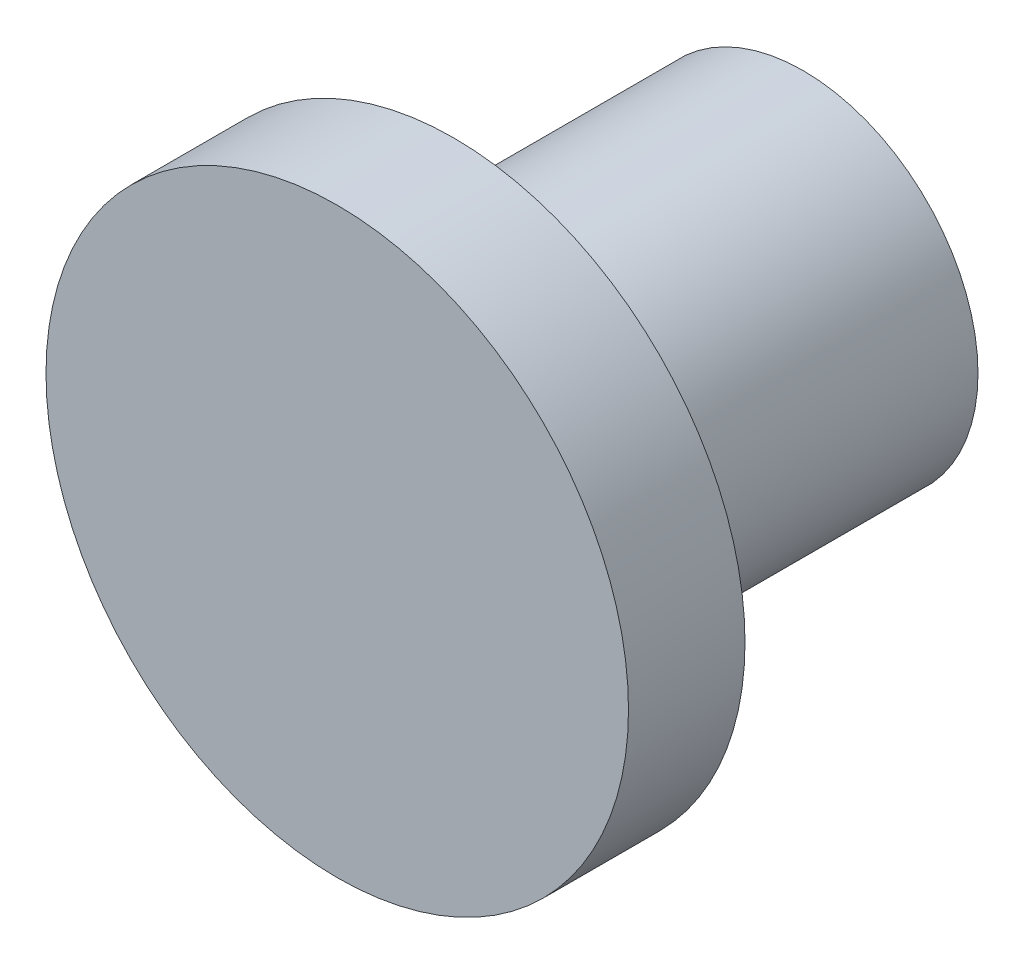
ISO-10303-21;
HEADER;
FILE_DESCRIPTION(('STEP AP214'),'2;1');
FILE_NAME('part.step','',(''),(''),'','','');
FILE_SCHEMA(('AUTOMOTIVE_DESIGN { 1 0 10303 214 1 1 1 1 }'));
ENDSEC;
DATA;
#1=APPLICATION_CONTEXT('core data for automotive mechanical design processes');
#2=APPLICATION_PROTOCOL_DEFINITION('international standard','automotive_design',2000,#1);
#3=PRODUCT_CONTEXT('',#1,'mechanical');
#4=PRODUCT('Part','Part','',(#3));
#5=PRODUCT_RELATED_PRODUCT_CATEGORY('part','',(#4));
#6=PRODUCT_DEFINITION_FORMATION('','',#4);
#7=PRODUCT_DEFINITION_CONTEXT('part definition',#1,'design');
#8=PRODUCT_DEFINITION('design','',#6,#7);
#9=PRODUCT_DEFINITION_SHAPE('','',#8);
#10=(LENGTH_UNIT() NAMED_UNIT(*) SI_UNIT(.MILLI.,.METRE.));
#11=(NAMED_UNIT(*) PLANE_ANGLE_UNIT() SI_UNIT($,.RADIAN.));
#12=(NAMED_UNIT(*) SI_UNIT($,.STERADIAN.) SOLID_ANGLE_UNIT());
#13=UNCERTAINTY_MEASURE_WITH_UNIT(LENGTH_MEASURE(1.E-05),#10,'distance_accuracy_value','');
#14=(GEOMETRIC_REPRESENTATION_CONTEXT(3) GLOBAL_UNCERTAINTY_ASSIGNED_CONTEXT((#13)) GLOBAL_UNIT_ASSIGNED_CONTEXT((#10,
#11,#12)) REPRESENTATION_CONTEXT('',''));
#15=CARTESIAN_POINT('',(0.,0.,0.));
#16=DIRECTION('',(0.,0.,1.));
#17=DIRECTION('',(1.,0.,0.));
#18=AXIS2_PLACEMENT_3D('',#15,#16,#17);
#19=CARTESIAN_POINT('',(0.,0.,3.));
#20=DIRECTION('',(0.,0.,-1.));
#21=DIRECTION('',(-1.,0.,0.));
#22=AXIS2_PLACEMENT_3D('',#19,#20,#21);
#23=CYLINDRICAL_SURFACE('',#22,1.5);
#24=CARTESIAN_POINT('',(0.,0.,3.));
#25=DIRECTION('',(0.,0.,1.));
#26=DIRECTION('',(1.,0.,0.));
#27=AXIS2_PLACEMENT_3D('',#24,#25,#26);
#28=CIRCLE('',#27,1.5);
#29=CARTESIAN_POINT('',(1.5,0.,3.));
#30=VERTEX_POINT('',#29);
#31=EDGE_CURVE('E10',#30,#30,#28,.T.);
#32=ORIENTED_EDGE('',*,*,#31,.F.);
#33=EDGE_LOOP('',(#32));
#34=FACE_BOUND('',#33,.T.);
#35=CARTESIAN_POINT('',(0.,0.,0.));
#36=DIRECTION('',(0.,0.,1.));
#37=DIRECTION('',(1.,0.,0.));
#38=AXIS2_PLACEMENT_3D('',#35,#36,#37);
#39=CIRCLE('',#38,1.5);
#40=CARTESIAN_POINT('',(1.5,0.,0.));
#41=VERTEX_POINT('',#40);
#42=EDGE_CURVE('E40',#41,#41,#39,.T.);
#43=ORIENTED_EDGE('',*,*,#42,.T.);
#44=EDGE_LOOP('',(#43));
#45=FACE_BOUND('',#44,.T.);
#46=ADVANCED_FACE('F37',(#34,#45),#23,.T.);
#47=CARTESIAN_POINT('',(0.,0.,0.));
#48=DIRECTION('',(0.,0.,1.));
#49=DIRECTION('',(1.,0.,0.));
#50=AXIS2_PLACEMENT_3D('',#47,#48,#49);
#51=PLANE('',#50);
#52=ORIENTED_EDGE('',*,*,#42,.F.);
#53=EDGE_LOOP('',(#52));
#54=FACE_BOUND('',#53,.T.);
#55=ADVANCED_FACE('F60',(#54),#51,.F.);
#56=CARTESIAN_POINT('',(0.,0.,4.));
#57=DIRECTION('',(0.,0.,-1.));
#58=DIRECTION('',(-1.,0.,0.));
#59=AXIS2_PLACEMENT_3D('',#56,#57,#58);
#60=CYLINDRICAL_SURFACE('',#59,2.5);
#61=CARTESIAN_POINT('',(0.,0.,4.));
#62=DIRECTION('',(0.,0.,1.));
#63=DIRECTION('',(1.,0.,0.));
#64=AXIS2_PLACEMENT_3D('',#61,#62,#63);
#65=CIRCLE('',#64,2.5);
#66=CARTESIAN_POINT('',(2.5,0.,4.));
#67=VERTEX_POINT('',#66);
#68=EDGE_CURVE('E47',#67,#67,#65,.T.);
#69=ORIENTED_EDGE('',*,*,#68,.F.);
#70=EDGE_LOOP('',(#69));
#71=FACE_BOUND('',#70,.T.);
#72=CARTESIAN_POINT('',(0.,0.,3.));
#73=DIRECTION('',(0.,0.,1.));
#74=DIRECTION('',(1.,0.,0.));
#75=AXIS2_PLACEMENT_3D('',#72,#73,#74);
#76=CIRCLE('',#75,2.5);
#77=CARTESIAN_POINT('',(2.5,0.,3.));
#78=VERTEX_POINT('',#77);
#79=EDGE_CURVE('E49',#78,#78,#76,.T.);
#80=ORIENTED_EDGE('',*,*,#79,.T.);
#81=EDGE_LOOP('',(#80));
#82=FACE_BOUND('',#81,.T.);
#83=ADVANCED_FACE('F57',(#71,#82),#60,.T.);
#84=CARTESIAN_POINT('',(0.,0.,4.));
#85=DIRECTION('',(0.,0.,1.));
#86=DIRECTION('',(1.,0.,0.));
#87=AXIS2_PLACEMENT_3D('',#84,#85,#86);
#88=PLANE('',#87);
#89=ORIENTED_EDGE('',*,*,#68,.T.);
#90=EDGE_LOOP('',(#89));
#91=FACE_BOUND('',#90,.T.);
#92=ADVANCED_FACE('F55',(#91),#88,.T.);
#93=CARTESIAN_POINT('',(0.,0.,3.));
#94=DIRECTION('',(0.,0.,1.));
#95=DIRECTION('',(1.,0.,0.));
#96=AXIS2_PLACEMENT_3D('',#93,#94,#95);
#97=PLANE('',#96);
#98=ORIENTED_EDGE('',*,*,#31,.T.);
#99=EDGE_LOOP('',(#98));
#100=FACE_BOUND('',#99,.T.);
#101=ORIENTED_EDGE('',*,*,#79,.F.);
#102=EDGE_LOOP('',(#101));
#103=FACE_BOUND('',#102,.T.);
#104=ADVANCED_FACE('F64',(#100,#103),#97,.F.);
#105=CLOSED_SHELL('',(#46,#55,#83,#92,#104));
#106=MANIFOLD_SOLID_BREP('B2',#105);
#107=ADVANCED_BREP_SHAPE_REPRESENTATION('',(#18,#106),#14);
#108=SHAPE_DEFINITION_REPRESENTATION(#9,#107);
ENDSEC;
END-ISO-10303-21;
